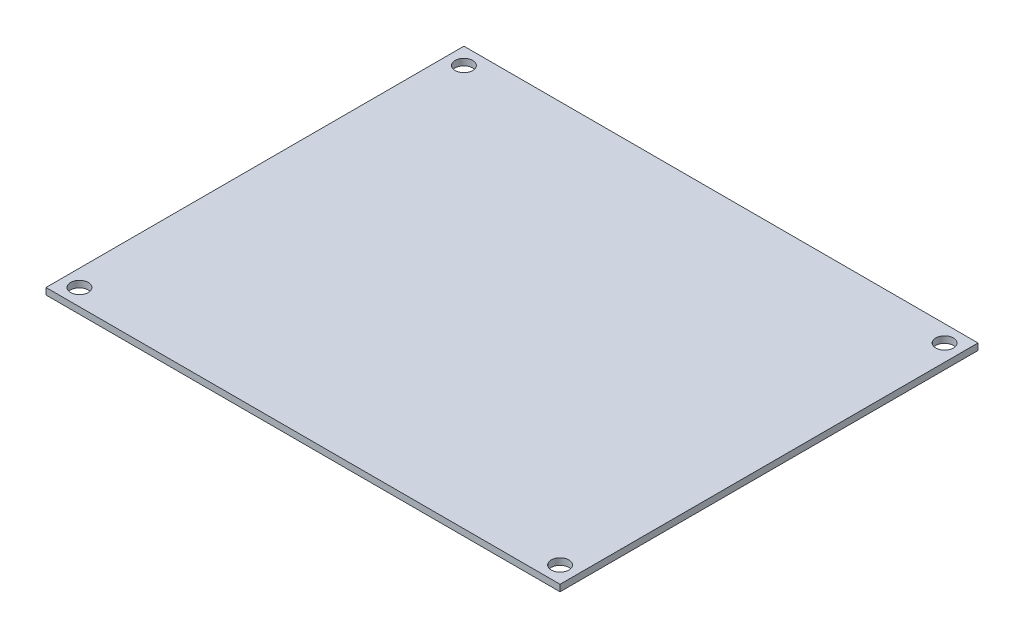
ISO-10303-21;
HEADER;
FILE_DESCRIPTION(('STEP AP214'),'2;1');
FILE_NAME('part.step','',(''),(''),'','','');
FILE_SCHEMA(('AUTOMOTIVE_DESIGN { 1 0 10303 214 1 1 1 1 }'));
ENDSEC;
DATA;
#1=APPLICATION_CONTEXT('core data for automotive mechanical design processes');
#2=APPLICATION_PROTOCOL_DEFINITION('international standard','automotive_design',2000,#1);
#3=PRODUCT_CONTEXT('',#1,'mechanical');
#4=PRODUCT('Part','Part','',(#3));
#5=PRODUCT_RELATED_PRODUCT_CATEGORY('part','',(#4));
#6=PRODUCT_DEFINITION_FORMATION('','',#4);
#7=PRODUCT_DEFINITION_CONTEXT('part definition',#1,'design');
#8=PRODUCT_DEFINITION('design','',#6,#7);
#9=PRODUCT_DEFINITION_SHAPE('','',#8);
#10=(LENGTH_UNIT() NAMED_UNIT(*) SI_UNIT(.MILLI.,.METRE.));
#11=(NAMED_UNIT(*) PLANE_ANGLE_UNIT() SI_UNIT($,.RADIAN.));
#12=(NAMED_UNIT(*) SI_UNIT($,.STERADIAN.) SOLID_ANGLE_UNIT());
#13=UNCERTAINTY_MEASURE_WITH_UNIT(LENGTH_MEASURE(1.E-05),#10,'distance_accuracy_value','');
#14=(GEOMETRIC_REPRESENTATION_CONTEXT(3) GLOBAL_UNCERTAINTY_ASSIGNED_CONTEXT((#13)) GLOBAL_UNIT_ASSIGNED_CONTEXT((#10,
#11,#12)) REPRESENTATION_CONTEXT('',''));
#15=CARTESIAN_POINT('',(0.,0.,0.));
#16=DIRECTION('',(0.,0.,1.));
#17=DIRECTION('',(1.,0.,0.));
#18=AXIS2_PLACEMENT_3D('',#15,#16,#17);
#19=CARTESIAN_POINT('',(0.,1.56999999999999,0.));
#20=DIRECTION('',(0.,-1.,0.));
#21=DIRECTION('',(0.,0.,-1.));
#22=AXIS2_PLACEMENT_3D('',#19,#20,#21);
#23=PLANE('',#22);
#24=DIRECTION('',(0.,0.,1.));
#25=VECTOR('',#24,1.);
#26=CARTESIAN_POINT('',(0.,1.56999999999999,0.));
#27=LINE('',#26,#25);
#28=CARTESIAN_POINT('',(0.,1.57000000000002,-100.));
#29=VERTEX_POINT('',#28);
#30=CARTESIAN_POINT('',(0.,1.56999999999999,0.));
#31=VERTEX_POINT('',#30);
#32=EDGE_CURVE('E84',#29,#31,#27,.T.);
#33=ORIENTED_EDGE('',*,*,#32,.T.);
#34=DIRECTION('',(1.,0.,0.));
#35=VECTOR('',#34,1.);
#36=CARTESIAN_POINT('',(0.,1.56999999999999,0.));
#37=LINE('',#36,#35);
#38=CARTESIAN_POINT('',(123.,1.56999999999999,0.));
#39=VERTEX_POINT('',#38);
#40=EDGE_CURVE('E79',#31,#39,#37,.T.);
#41=ORIENTED_EDGE('',*,*,#40,.T.);
#42=DIRECTION('',(0.,0.,-1.));
#43=VECTOR('',#42,1.);
#44=CARTESIAN_POINT('',(123.,1.56999999999999,0.));
#45=LINE('',#44,#43);
#46=CARTESIAN_POINT('',(123.,1.57000000000002,-100.));
#47=VERTEX_POINT('',#46);
#48=EDGE_CURVE('E82',#39,#47,#45,.T.);
#49=ORIENTED_EDGE('',*,*,#48,.T.);
#50=DIRECTION('',(-1.,0.,0.));
#51=VECTOR('',#50,1.);
#52=CARTESIAN_POINT('',(0.,1.57000000000002,-100.));
#53=LINE('',#52,#51);
#54=EDGE_CURVE('E49',#47,#29,#53,.T.);
#55=ORIENTED_EDGE('',*,*,#54,.T.);
#56=EDGE_LOOP('',(#33,#41,#49,#55));
#57=FACE_BOUND('',#56,.T.);
#58=CARTESIAN_POINT('',(3.99999999999995,1.57000000000002,-96.));
#59=DIRECTION('',(0.,1.,0.));
#60=DIRECTION('',(0.,0.,1.));
#61=AXIS2_PLACEMENT_3D('',#58,#59,#60);
#62=CIRCLE('',#61,2.1);
#63=CARTESIAN_POINT('',(3.99999999999995,1.57000000000002,-98.1));
#64=VERTEX_POINT('',#63);
#65=EDGE_CURVE('E99',#64,#64,#62,.T.);
#66=ORIENTED_EDGE('',*,*,#65,.F.);
#67=EDGE_LOOP('',(#66));
#68=FACE_BOUND('',#67,.T.);
#69=CARTESIAN_POINT('',(119.,1.57000000000002,-96.));
#70=DIRECTION('',(0.,1.,0.));
#71=DIRECTION('',(0.,0.,1.));
#72=AXIS2_PLACEMENT_3D('',#69,#70,#71);
#73=CIRCLE('',#72,2.1);
#74=CARTESIAN_POINT('',(119.,1.57000000000002,-98.1));
#75=VERTEX_POINT('',#74);
#76=EDGE_CURVE('E114',#75,#75,#73,.T.);
#77=ORIENTED_EDGE('',*,*,#76,.F.);
#78=EDGE_LOOP('',(#77));
#79=FACE_BOUND('',#78,.T.);
#80=CARTESIAN_POINT('',(119.,1.56999999999999,-4.));
#81=DIRECTION('',(0.,1.,0.));
#82=DIRECTION('',(0.,0.,1.));
#83=AXIS2_PLACEMENT_3D('',#80,#81,#82);
#84=CIRCLE('',#83,2.1);
#85=CARTESIAN_POINT('',(119.,1.56999999999999,-6.10000000000001));
#86=VERTEX_POINT('',#85);
#87=EDGE_CURVE('E120',#86,#86,#84,.T.);
#88=ORIENTED_EDGE('',*,*,#87,.F.);
#89=EDGE_LOOP('',(#88));
#90=FACE_BOUND('',#89,.T.);
#91=CARTESIAN_POINT('',(3.99999999999995,1.56999999999999,-4.));
#92=DIRECTION('',(0.,1.,0.));
#93=DIRECTION('',(0.,0.,1.));
#94=AXIS2_PLACEMENT_3D('',#91,#92,#93);
#95=CIRCLE('',#94,2.1);
#96=CARTESIAN_POINT('',(3.99999999999995,1.56999999999999,-6.1));
#97=VERTEX_POINT('',#96);
#98=EDGE_CURVE('E126',#97,#97,#95,.T.);
#99=ORIENTED_EDGE('',*,*,#98,.F.);
#100=EDGE_LOOP('',(#99));
#101=FACE_BOUND('',#100,.T.);
#102=ADVANCED_FACE('F32',(#57,#68,#79,#90,#101),#23,.F.);
#103=CARTESIAN_POINT('',(0.,0.,0.));
#104=DIRECTION('',(0.,-1.,0.));
#105=DIRECTION('',(0.,0.,-1.));
#106=AXIS2_PLACEMENT_3D('',#103,#104,#105);
#107=PLANE('',#106);
#108=CARTESIAN_POINT('',(119.,0.,-4.));
#109=DIRECTION('',(0.,1.,0.));
#110=DIRECTION('',(0.,0.,1.));
#111=AXIS2_PLACEMENT_3D('',#108,#109,#110);
#112=CIRCLE('',#111,2.1);
#113=CARTESIAN_POINT('',(119.,0.,-6.10000000000001));
#114=VERTEX_POINT('',#113);
#115=EDGE_CURVE('E123',#114,#114,#112,.T.);
#116=ORIENTED_EDGE('',*,*,#115,.T.);
#117=EDGE_LOOP('',(#116));
#118=FACE_BOUND('',#117,.T.);
#119=CARTESIAN_POINT('',(3.99999999999995,0.,-96.));
#120=DIRECTION('',(0.,1.,0.));
#121=DIRECTION('',(0.,0.,1.));
#122=AXIS2_PLACEMENT_3D('',#119,#120,#121);
#123=CIRCLE('',#122,2.1);
#124=CARTESIAN_POINT('',(3.99999999999995,0.,-98.1));
#125=VERTEX_POINT('',#124);
#126=EDGE_CURVE('E111',#125,#125,#123,.T.);
#127=ORIENTED_EDGE('',*,*,#126,.T.);
#128=EDGE_LOOP('',(#127));
#129=FACE_BOUND('',#128,.T.);
#130=DIRECTION('',(0.,0.,1.));
#131=VECTOR('',#130,1.);
#132=CARTESIAN_POINT('',(0.,0.,0.));
#133=LINE('',#132,#131);
#134=CARTESIAN_POINT('',(0.,0.,-100.));
#135=VERTEX_POINT('',#134);
#136=CARTESIAN_POINT('',(0.,0.,0.));
#137=VERTEX_POINT('',#136);
#138=EDGE_CURVE('E96',#135,#137,#133,.T.);
#139=ORIENTED_EDGE('',*,*,#138,.F.);
#140=DIRECTION('',(-1.,0.,0.));
#141=VECTOR('',#140,1.);
#142=CARTESIAN_POINT('',(0.,0.,-100.));
#143=LINE('',#142,#141);
#144=CARTESIAN_POINT('',(123.,0.,-100.));
#145=VERTEX_POINT('',#144);
#146=EDGE_CURVE('E72',#145,#135,#143,.T.);
#147=ORIENTED_EDGE('',*,*,#146,.F.);
#148=DIRECTION('',(0.,0.,-1.));
#149=VECTOR('',#148,1.);
#150=CARTESIAN_POINT('',(123.,0.,0.));
#151=LINE('',#150,#149);
#152=CARTESIAN_POINT('',(123.,0.,0.));
#153=VERTEX_POINT('',#152);
#154=EDGE_CURVE('E66',#153,#145,#151,.T.);
#155=ORIENTED_EDGE('',*,*,#154,.F.);
#156=DIRECTION('',(1.,0.,0.));
#157=VECTOR('',#156,1.);
#158=CARTESIAN_POINT('',(0.,0.,0.));
#159=LINE('',#158,#157);
#160=EDGE_CURVE('E88',#137,#153,#159,.T.);
#161=ORIENTED_EDGE('',*,*,#160,.F.);
#162=EDGE_LOOP('',(#139,#147,#155,#161));
#163=FACE_BOUND('',#162,.T.);
#164=CARTESIAN_POINT('',(119.,0.,-96.));
#165=DIRECTION('',(0.,1.,0.));
#166=DIRECTION('',(0.,0.,1.));
#167=AXIS2_PLACEMENT_3D('',#164,#165,#166);
#168=CIRCLE('',#167,2.1);
#169=CARTESIAN_POINT('',(119.,0.,-98.1));
#170=VERTEX_POINT('',#169);
#171=EDGE_CURVE('E117',#170,#170,#168,.T.);
#172=ORIENTED_EDGE('',*,*,#171,.T.);
#173=EDGE_LOOP('',(#172));
#174=FACE_BOUND('',#173,.T.);
#175=CARTESIAN_POINT('',(3.99999999999995,0.,-4.));
#176=DIRECTION('',(0.,1.,0.));
#177=DIRECTION('',(0.,0.,1.));
#178=AXIS2_PLACEMENT_3D('',#175,#176,#177);
#179=CIRCLE('',#178,2.1);
#180=CARTESIAN_POINT('',(3.99999999999995,0.,-6.1));
#181=VERTEX_POINT('',#180);
#182=EDGE_CURVE('E129',#181,#181,#179,.T.);
#183=ORIENTED_EDGE('',*,*,#182,.T.);
#184=EDGE_LOOP('',(#183));
#185=FACE_BOUND('',#184,.T.);
#186=ADVANCED_FACE('F107',(#118,#129,#163,#174,#185),#107,.T.);
#187=CARTESIAN_POINT('',(0.,1.56999999999999,0.));
#188=DIRECTION('',(1.,0.,0.));
#189=DIRECTION('',(0.,0.,-1.));
#190=AXIS2_PLACEMENT_3D('',#187,#188,#189);
#191=PLANE('',#190);
#192=ORIENTED_EDGE('',*,*,#138,.T.);
#193=DIRECTION('',(0.,-1.,0.));
#194=VECTOR('',#193,1.);
#195=CARTESIAN_POINT('',(0.,1.56999999999999,0.));
#196=LINE('',#195,#194);
#197=EDGE_CURVE('E11',#31,#137,#196,.T.);
#198=ORIENTED_EDGE('',*,*,#197,.F.);
#199=ORIENTED_EDGE('',*,*,#32,.F.);
#200=DIRECTION('',(0.,-1.,0.));
#201=VECTOR('',#200,1.);
#202=CARTESIAN_POINT('',(0.,1.57000000000002,-100.));
#203=LINE('',#202,#201);
#204=EDGE_CURVE('E92',#29,#135,#203,.T.);
#205=ORIENTED_EDGE('',*,*,#204,.T.);
#206=EDGE_LOOP('',(#192,#198,#199,#205));
#207=FACE_BOUND('',#206,.T.);
#208=ADVANCED_FACE('F34',(#207),#191,.F.);
#209=CARTESIAN_POINT('',(0.,1.56999999999999,0.));
#210=DIRECTION('',(0.,0.,-1.));
#211=DIRECTION('',(-1.,0.,0.));
#212=AXIS2_PLACEMENT_3D('',#209,#210,#211);
#213=PLANE('',#212);
#214=ORIENTED_EDGE('',*,*,#160,.T.);
#215=DIRECTION('',(0.,-1.,0.));
#216=VECTOR('',#215,1.);
#217=CARTESIAN_POINT('',(123.,1.56999999999999,0.));
#218=LINE('',#217,#216);
#219=EDGE_CURVE('E41',#39,#153,#218,.T.);
#220=ORIENTED_EDGE('',*,*,#219,.F.);
#221=ORIENTED_EDGE('',*,*,#40,.F.);
#222=ORIENTED_EDGE('',*,*,#197,.T.);
#223=EDGE_LOOP('',(#214,#220,#221,#222));
#224=FACE_BOUND('',#223,.T.);
#225=ADVANCED_FACE('F87',(#224),#213,.F.);
#226=CARTESIAN_POINT('',(123.,1.56999999999999,0.));
#227=DIRECTION('',(-1.,0.,0.));
#228=DIRECTION('',(0.,0.,1.));
#229=AXIS2_PLACEMENT_3D('',#226,#227,#228);
#230=PLANE('',#229);
#231=ORIENTED_EDGE('',*,*,#154,.T.);
#232=DIRECTION('',(0.,-1.,0.));
#233=VECTOR('',#232,1.);
#234=CARTESIAN_POINT('',(123.,1.57000000000002,-100.));
#235=LINE('',#234,#233);
#236=EDGE_CURVE('E89',#47,#145,#235,.T.);
#237=ORIENTED_EDGE('',*,*,#236,.F.);
#238=ORIENTED_EDGE('',*,*,#48,.F.);
#239=ORIENTED_EDGE('',*,*,#219,.T.);
#240=EDGE_LOOP('',(#231,#237,#238,#239));
#241=FACE_BOUND('',#240,.T.);
#242=ADVANCED_FACE('F90',(#241),#230,.F.);
#243=CARTESIAN_POINT('',(0.,1.57000000000002,-100.));
#244=DIRECTION('',(0.,0.,1.));
#245=DIRECTION('',(1.,0.,0.));
#246=AXIS2_PLACEMENT_3D('',#243,#244,#245);
#247=PLANE('',#246);
#248=ORIENTED_EDGE('',*,*,#146,.T.);
#249=ORIENTED_EDGE('',*,*,#204,.F.);
#250=ORIENTED_EDGE('',*,*,#54,.F.);
#251=ORIENTED_EDGE('',*,*,#236,.T.);
#252=EDGE_LOOP('',(#248,#249,#250,#251));
#253=FACE_BOUND('',#252,.T.);
#254=ADVANCED_FACE('F104',(#253),#247,.F.);
#255=CARTESIAN_POINT('',(3.99999999999995,1.57000000000002,-96.));
#256=DIRECTION('',(0.,-1.,0.));
#257=DIRECTION('',(0.,0.,-1.));
#258=AXIS2_PLACEMENT_3D('',#255,#256,#257);
#259=CYLINDRICAL_SURFACE('',#258,2.1);
#260=CARTESIAN_POINT('',(3.99999999999995,1.57000000000002,-98.1));
#261=CARTESIAN_POINT('',(3.99999999999995,1.55364583333335,-98.1));
#262=CARTESIAN_POINT('',(3.99999999999995,1.53729166666668,-98.1));
#263=CARTESIAN_POINT('',(3.99999999999995,1.50458333333335,-98.1));
#264=CARTESIAN_POINT('',(3.99999999999995,1.48822916666668,-98.1));
#265=CARTESIAN_POINT('',(3.99999999999995,1.45552083333335,-98.1));
#266=CARTESIAN_POINT('',(3.99999999999995,1.43916666666668,-98.1));
#267=CARTESIAN_POINT('',(3.99999999999995,1.40645833333335,-98.1));
#268=CARTESIAN_POINT('',(3.99999999999995,1.39010416666668,-98.1));
#269=CARTESIAN_POINT('',(3.99999999999995,1.35739583333335,-98.1));
#270=CARTESIAN_POINT('',(3.99999999999995,1.34104166666668,-98.1));
#271=CARTESIAN_POINT('',(3.99999999999995,1.30833333333335,-98.1));
#272=CARTESIAN_POINT('',(3.99999999999995,1.29197916666668,-98.1));
#273=CARTESIAN_POINT('',(3.99999999999995,1.25927083333335,-98.1));
#274=CARTESIAN_POINT('',(3.99999999999995,1.24291666666668,-98.1));
#275=CARTESIAN_POINT('',(3.99999999999995,1.21020833333335,-98.1));
#276=CARTESIAN_POINT('',(3.99999999999995,1.19385416666668,-98.1));
#277=CARTESIAN_POINT('',(3.99999999999995,1.16114583333334,-98.1));
#278=CARTESIAN_POINT('',(3.99999999999995,1.14479166666668,-98.1));
#279=CARTESIAN_POINT('',(3.99999999999995,1.11208333333334,-98.1));
#280=CARTESIAN_POINT('',(3.99999999999995,1.09572916666668,-98.1));
#281=CARTESIAN_POINT('',(3.99999999999995,1.06302083333334,-98.1));
#282=CARTESIAN_POINT('',(3.99999999999995,1.04666666666668,-98.1));
#283=CARTESIAN_POINT('',(3.99999999999995,1.01395833333334,-98.1));
#284=CARTESIAN_POINT('',(3.99999999999995,0.997604166666677,-98.1));
#285=CARTESIAN_POINT('',(3.99999999999995,0.964895833333343,-98.1));
#286=CARTESIAN_POINT('',(3.99999999999995,0.948541666666676,-98.1));
#287=CARTESIAN_POINT('',(3.99999999999995,0.915833333333342,-98.1));
#288=CARTESIAN_POINT('',(3.99999999999995,0.899479166666676,-98.1));
#289=CARTESIAN_POINT('',(3.99999999999995,0.866770833333342,-98.1));
#290=CARTESIAN_POINT('',(3.99999999999995,0.850416666666675,-98.1));
#291=CARTESIAN_POINT('',(3.99999999999995,0.817708333333342,-98.1));
#292=CARTESIAN_POINT('',(3.99999999999995,0.801354166666675,-98.1));
#293=CARTESIAN_POINT('',(3.99999999999995,0.768645833333341,-98.1));
#294=CARTESIAN_POINT('',(3.99999999999995,0.752291666666674,-98.1));
#295=CARTESIAN_POINT('',(3.99999999999995,0.719583333333341,-98.1));
#296=CARTESIAN_POINT('',(3.99999999999995,0.703229166666674,-98.1));
#297=CARTESIAN_POINT('',(3.99999999999995,0.67052083333334,-98.1));
#298=CARTESIAN_POINT('',(3.99999999999995,0.654166666666673,-98.1));
#299=CARTESIAN_POINT('',(3.99999999999995,0.62145833333334,-98.1));
#300=CARTESIAN_POINT('',(3.99999999999995,0.605104166666673,-98.1));
#301=CARTESIAN_POINT('',(3.99999999999995,0.572395833333339,-98.1));
#302=CARTESIAN_POINT('',(3.99999999999995,0.556041666666672,-98.1));
#303=CARTESIAN_POINT('',(3.99999999999995,0.523333333333338,-98.1));
#304=CARTESIAN_POINT('',(3.99999999999995,0.506979166666672,-98.1));
#305=CARTESIAN_POINT('',(3.99999999999995,0.474270833333338,-98.1));
#306=CARTESIAN_POINT('',(3.99999999999995,0.457916666666671,-98.1));
#307=CARTESIAN_POINT('',(3.99999999999995,0.425208333333337,-98.1));
#308=CARTESIAN_POINT('',(3.99999999999995,0.408854166666671,-98.1));
#309=CARTESIAN_POINT('',(3.99999999999995,0.376145833333337,-98.1));
#310=CARTESIAN_POINT('',(3.99999999999995,0.35979166666667,-98.1));
#311=CARTESIAN_POINT('',(3.99999999999995,0.327083333333336,-98.1));
#312=CARTESIAN_POINT('',(3.99999999999995,0.31072916666667,-98.1));
#313=CARTESIAN_POINT('',(3.99999999999995,0.278020833333336,-98.1));
#314=CARTESIAN_POINT('',(3.99999999999995,0.261666666666669,-98.1));
#315=CARTESIAN_POINT('',(3.99999999999995,0.228958333333335,-98.1));
#316=CARTESIAN_POINT('',(3.99999999999995,0.212604166666669,-98.1));
#317=CARTESIAN_POINT('',(3.99999999999995,0.179895833333335,-98.1));
#318=CARTESIAN_POINT('',(3.99999999999995,0.163541666666668,-98.1));
#319=CARTESIAN_POINT('',(3.99999999999995,0.130833333333334,-98.1));
#320=CARTESIAN_POINT('',(3.99999999999995,0.114479166666668,-98.1));
#321=CARTESIAN_POINT('',(3.99999999999995,0.0817708333333342,-98.1));
#322=CARTESIAN_POINT('',(3.99999999999995,0.0654166666666673,-98.1));
#323=CARTESIAN_POINT('',(3.99999999999995,0.0327083333333337,-98.1));
#324=CARTESIAN_POINT('',(3.99999999999995,0.0163541666666668,-98.1));
#325=CARTESIAN_POINT('',(3.99999999999995,0.,-98.1));
#326=B_SPLINE_CURVE_WITH_KNOTS('',3,(#260,#261,#262,#263,#264,#265,#266,#267,#268,#269,#270,
#271,#272,#273,#274,#275,#276,#277,#278,#279,#280,#281,#282,#283,#284,#285,#286,#287,#288,#289,
#290,#291,#292,#293,#294,#295,#296,#297,#298,#299,#300,#301,#302,#303,#304,#305,#306,#307,#308,
#309,#310,#311,#312,#313,#314,#315,#316,#317,#318,#319,#320,#321,#322,#323,#324,#325),
.UNSPECIFIED.,.F.,.F.,(4,2,2,2,2,2,2,2,2,2,2,2,2,2,2,2,2,2,2,2,2,2,2,2,2,2,2,2,2,2,2,2,4),(0.,
0.0490625000000003,0.0981250000000008,0.147187500000001,0.196250000000002,0.245312500000002,
0.294375000000003,0.343437500000003,0.392500000000004,0.441562500000004,0.490625000000005,
0.539687500000005,0.588750000000006,0.637812500000006,0.686875000000007,0.735937500000007,
0.785000000000008,0.834062500000008,0.883125000000009,0.932187500000009,0.98125000000001,
1.03031250000001,1.07937500000001,1.12843750000001,1.17750000000001,1.22656250000001,
1.27562500000001,1.32468750000001,1.37375000000001,1.42281250000001,1.47187500000001,
1.52093750000002,1.57000000000002),.UNSPECIFIED.);
#327=EDGE_CURVE('BSEAM146',#64,#125,#326,.T.);
#328=ORIENTED_EDGE('',*,*,#65,.T.);
#329=ORIENTED_EDGE('',*,*,#126,.F.);
#330=ORIENTED_EDGE('',*,*,#327,.T.);
#331=ORIENTED_EDGE('',*,*,#327,.F.);
#332=EDGE_LOOP('',(#328,#330,#329,#331));
#333=FACE_BOUND('',#332,.T.);
#334=ADVANCED_FACE('F146',(#333),#259,.F.);
#335=CARTESIAN_POINT('',(119.,1.57000000000002,-96.));
#336=DIRECTION('',(0.,-1.,0.));
#337=DIRECTION('',(0.,0.,-1.));
#338=AXIS2_PLACEMENT_3D('',#335,#336,#337);
#339=CYLINDRICAL_SURFACE('',#338,2.1);
#340=CARTESIAN_POINT('',(119.,1.57000000000002,-98.1));
#341=CARTESIAN_POINT('',(119.,1.55364583333335,-98.1));
#342=CARTESIAN_POINT('',(119.,1.53729166666668,-98.1));
#343=CARTESIAN_POINT('',(119.,1.50458333333335,-98.1));
#344=CARTESIAN_POINT('',(119.,1.48822916666668,-98.1));
#345=CARTESIAN_POINT('',(119.,1.45552083333335,-98.1));
#346=CARTESIAN_POINT('',(119.,1.43916666666668,-98.1));
#347=CARTESIAN_POINT('',(119.,1.40645833333335,-98.1));
#348=CARTESIAN_POINT('',(119.,1.39010416666668,-98.1));
#349=CARTESIAN_POINT('',(119.,1.35739583333335,-98.1));
#350=CARTESIAN_POINT('',(119.,1.34104166666668,-98.1));
#351=CARTESIAN_POINT('',(119.,1.30833333333335,-98.1));
#352=CARTESIAN_POINT('',(119.,1.29197916666668,-98.1));
#353=CARTESIAN_POINT('',(119.,1.25927083333335,-98.1));
#354=CARTESIAN_POINT('',(119.,1.24291666666668,-98.1));
#355=CARTESIAN_POINT('',(119.,1.21020833333335,-98.1));
#356=CARTESIAN_POINT('',(119.,1.19385416666668,-98.1));
#357=CARTESIAN_POINT('',(119.,1.16114583333334,-98.1));
#358=CARTESIAN_POINT('',(119.,1.14479166666668,-98.1));
#359=CARTESIAN_POINT('',(119.,1.11208333333334,-98.1));
#360=CARTESIAN_POINT('',(119.,1.09572916666668,-98.1));
#361=CARTESIAN_POINT('',(119.,1.06302083333334,-98.1));
#362=CARTESIAN_POINT('',(119.,1.04666666666668,-98.1));
#363=CARTESIAN_POINT('',(119.,1.01395833333334,-98.1));
#364=CARTESIAN_POINT('',(119.,0.997604166666677,-98.1));
#365=CARTESIAN_POINT('',(119.,0.964895833333343,-98.1));
#366=CARTESIAN_POINT('',(119.,0.948541666666676,-98.1));
#367=CARTESIAN_POINT('',(119.,0.915833333333342,-98.1));
#368=CARTESIAN_POINT('',(119.,0.899479166666676,-98.1));
#369=CARTESIAN_POINT('',(119.,0.866770833333342,-98.1));
#370=CARTESIAN_POINT('',(119.,0.850416666666675,-98.1));
#371=CARTESIAN_POINT('',(119.,0.817708333333342,-98.1));
#372=CARTESIAN_POINT('',(119.,0.801354166666675,-98.1));
#373=CARTESIAN_POINT('',(119.,0.768645833333341,-98.1));
#374=CARTESIAN_POINT('',(119.,0.752291666666674,-98.1));
#375=CARTESIAN_POINT('',(119.,0.719583333333341,-98.1));
#376=CARTESIAN_POINT('',(119.,0.703229166666674,-98.1));
#377=CARTESIAN_POINT('',(119.,0.67052083333334,-98.1));
#378=CARTESIAN_POINT('',(119.,0.654166666666673,-98.1));
#379=CARTESIAN_POINT('',(119.,0.62145833333334,-98.1));
#380=CARTESIAN_POINT('',(119.,0.605104166666673,-98.1));
#381=CARTESIAN_POINT('',(119.,0.572395833333339,-98.1));
#382=CARTESIAN_POINT('',(119.,0.556041666666672,-98.1));
#383=CARTESIAN_POINT('',(119.,0.523333333333338,-98.1));
#384=CARTESIAN_POINT('',(119.,0.506979166666672,-98.1));
#385=CARTESIAN_POINT('',(119.,0.474270833333338,-98.1));
#386=CARTESIAN_POINT('',(119.,0.457916666666671,-98.1));
#387=CARTESIAN_POINT('',(119.,0.425208333333337,-98.1));
#388=CARTESIAN_POINT('',(119.,0.408854166666671,-98.1));
#389=CARTESIAN_POINT('',(119.,0.376145833333337,-98.1));
#390=CARTESIAN_POINT('',(119.,0.35979166666667,-98.1));
#391=CARTESIAN_POINT('',(119.,0.327083333333336,-98.1));
#392=CARTESIAN_POINT('',(119.,0.31072916666667,-98.1));
#393=CARTESIAN_POINT('',(119.,0.278020833333336,-98.1));
#394=CARTESIAN_POINT('',(119.,0.261666666666669,-98.1));
#395=CARTESIAN_POINT('',(119.,0.228958333333335,-98.1));
#396=CARTESIAN_POINT('',(119.,0.212604166666669,-98.1));
#397=CARTESIAN_POINT('',(119.,0.179895833333335,-98.1));
#398=CARTESIAN_POINT('',(119.,0.163541666666668,-98.1));
#399=CARTESIAN_POINT('',(119.,0.130833333333334,-98.1));
#400=CARTESIAN_POINT('',(119.,0.114479166666668,-98.1));
#401=CARTESIAN_POINT('',(119.,0.0817708333333342,-98.1));
#402=CARTESIAN_POINT('',(119.,0.0654166666666673,-98.1));
#403=CARTESIAN_POINT('',(119.,0.0327083333333337,-98.1));
#404=CARTESIAN_POINT('',(119.,0.0163541666666668,-98.1));
#405=CARTESIAN_POINT('',(119.,0.,-98.1));
#406=B_SPLINE_CURVE_WITH_KNOTS('',3,(#340,#341,#342,#343,#344,#345,#346,#347,#348,#349,#350,
#351,#352,#353,#354,#355,#356,#357,#358,#359,#360,#361,#362,#363,#364,#365,#366,#367,#368,#369,
#370,#371,#372,#373,#374,#375,#376,#377,#378,#379,#380,#381,#382,#383,#384,#385,#386,#387,#388,
#389,#390,#391,#392,#393,#394,#395,#396,#397,#398,#399,#400,#401,#402,#403,#404,#405),
.UNSPECIFIED.,.F.,.F.,(4,2,2,2,2,2,2,2,2,2,2,2,2,2,2,2,2,2,2,2,2,2,2,2,2,2,2,2,2,2,2,2,4),(0.,
0.0490625000000003,0.0981250000000008,0.147187500000001,0.196250000000002,0.245312500000002,
0.294375000000003,0.343437500000003,0.392500000000004,0.441562500000004,0.490625000000005,
0.539687500000005,0.588750000000006,0.637812500000006,0.686875000000007,0.735937500000007,
0.785000000000008,0.834062500000008,0.883125000000009,0.932187500000009,0.98125000000001,
1.03031250000001,1.07937500000001,1.12843750000001,1.17750000000001,1.22656250000001,
1.27562500000001,1.32468750000001,1.37375000000001,1.42281250000001,1.47187500000001,
1.52093750000002,1.57000000000002),.UNSPECIFIED.);
#407=EDGE_CURVE('BSEAM192',#75,#170,#406,.T.);
#408=ORIENTED_EDGE('',*,*,#76,.T.);
#409=ORIENTED_EDGE('',*,*,#171,.F.);
#410=ORIENTED_EDGE('',*,*,#407,.T.);
#411=ORIENTED_EDGE('',*,*,#407,.F.);
#412=EDGE_LOOP('',(#408,#410,#409,#411));
#413=FACE_BOUND('',#412,.T.);
#414=ADVANCED_FACE('F192',(#413),#339,.F.);
#415=CARTESIAN_POINT('',(119.,1.56999999999999,-4.));
#416=DIRECTION('',(0.,-1.,0.));
#417=DIRECTION('',(0.,0.,-1.));
#418=AXIS2_PLACEMENT_3D('',#415,#416,#417);
#419=CYLINDRICAL_SURFACE('',#418,2.1);
#420=CARTESIAN_POINT('',(119.,1.56999999999999,-6.10000000000001));
#421=CARTESIAN_POINT('',(119.,1.55364583333332,-6.10000000000001));
#422=CARTESIAN_POINT('',(119.,1.53729166666665,-6.10000000000001));
#423=CARTESIAN_POINT('',(119.,1.50458333333332,-6.10000000000001));
#424=CARTESIAN_POINT('',(119.,1.48822916666666,-6.10000000000001));
#425=CARTESIAN_POINT('',(119.,1.45552083333332,-6.10000000000001));
#426=CARTESIAN_POINT('',(119.,1.43916666666666,-6.10000000000001));
#427=CARTESIAN_POINT('',(119.,1.40645833333332,-6.10000000000001));
#428=CARTESIAN_POINT('',(119.,1.39010416666666,-6.10000000000001));
#429=CARTESIAN_POINT('',(119.,1.35739583333332,-6.10000000000001));
#430=CARTESIAN_POINT('',(119.,1.34104166666666,-6.10000000000001));
#431=CARTESIAN_POINT('',(119.,1.30833333333332,-6.10000000000001));
#432=CARTESIAN_POINT('',(119.,1.29197916666666,-6.10000000000001));
#433=CARTESIAN_POINT('',(119.,1.25927083333332,-6.10000000000001));
#434=CARTESIAN_POINT('',(119.,1.24291666666666,-6.10000000000001));
#435=CARTESIAN_POINT('',(119.,1.21020833333332,-6.10000000000001));
#436=CARTESIAN_POINT('',(119.,1.19385416666666,-6.10000000000001));
#437=CARTESIAN_POINT('',(119.,1.16114583333332,-6.10000000000001));
#438=CARTESIAN_POINT('',(119.,1.14479166666666,-6.10000000000001));
#439=CARTESIAN_POINT('',(119.,1.11208333333332,-6.10000000000001));
#440=CARTESIAN_POINT('',(119.,1.09572916666666,-6.10000000000001));
#441=CARTESIAN_POINT('',(119.,1.06302083333333,-6.10000000000001));
#442=CARTESIAN_POINT('',(119.,1.04666666666666,-6.10000000000001));
#443=CARTESIAN_POINT('',(119.,1.01395833333333,-6.10000000000001));
#444=CARTESIAN_POINT('',(119.,0.997604166666659,-6.10000000000001));
#445=CARTESIAN_POINT('',(119.,0.964895833333326,-6.10000000000001));
#446=CARTESIAN_POINT('',(119.,0.948541666666659,-6.10000000000001));
#447=CARTESIAN_POINT('',(119.,0.915833333333326,-6.10000000000001));
#448=CARTESIAN_POINT('',(119.,0.89947916666666,-6.10000000000001));
#449=CARTESIAN_POINT('',(119.,0.866770833333327,-6.10000000000001));
#450=CARTESIAN_POINT('',(119.,0.85041666666666,-6.10000000000001));
#451=CARTESIAN_POINT('',(119.,0.817708333333327,-6.10000000000001));
#452=CARTESIAN_POINT('',(119.,0.80135416666666,-6.10000000000001));
#453=CARTESIAN_POINT('',(119.,0.768645833333327,-6.10000000000001));
#454=CARTESIAN_POINT('',(119.,0.752291666666661,-6.10000000000001));
#455=CARTESIAN_POINT('',(119.,0.719583333333328,-6.10000000000001));
#456=CARTESIAN_POINT('',(119.,0.703229166666661,-6.10000000000001));
#457=CARTESIAN_POINT('',(119.,0.670520833333328,-6.10000000000001));
#458=CARTESIAN_POINT('',(119.,0.654166666666662,-6.10000000000001));
#459=CARTESIAN_POINT('',(119.,0.621458333333329,-6.10000000000001));
#460=CARTESIAN_POINT('',(119.,0.605104166666662,-6.10000000000001));
#461=CARTESIAN_POINT('',(119.,0.572395833333329,-6.10000000000001));
#462=CARTESIAN_POINT('',(119.,0.556041666666662,-6.10000000000001));
#463=CARTESIAN_POINT('',(119.,0.523333333333329,-6.10000000000001));
#464=CARTESIAN_POINT('',(119.,0.506979166666663,-6.10000000000001));
#465=CARTESIAN_POINT('',(119.,0.47427083333333,-6.10000000000001));
#466=CARTESIAN_POINT('',(119.,0.457916666666663,-6.10000000000001));
#467=CARTESIAN_POINT('',(119.,0.42520833333333,-6.10000000000001));
#468=CARTESIAN_POINT('',(119.,0.408854166666663,-6.10000000000001));
#469=CARTESIAN_POINT('',(119.,0.37614583333333,-6.10000000000001));
#470=CARTESIAN_POINT('',(119.,0.359791666666664,-6.10000000000001));
#471=CARTESIAN_POINT('',(119.,0.327083333333331,-6.10000000000001));
#472=CARTESIAN_POINT('',(119.,0.310729166666664,-6.10000000000001));
#473=CARTESIAN_POINT('',(119.,0.278020833333331,-6.10000000000001));
#474=CARTESIAN_POINT('',(119.,0.261666666666664,-6.10000000000001));
#475=CARTESIAN_POINT('',(119.,0.228958333333331,-6.10000000000001));
#476=CARTESIAN_POINT('',(119.,0.212604166666665,-6.10000000000001));
#477=CARTESIAN_POINT('',(119.,0.179895833333332,-6.10000000000001));
#478=CARTESIAN_POINT('',(119.,0.163541666666665,-6.10000000000001));
#479=CARTESIAN_POINT('',(119.,0.130833333333332,-6.10000000000001));
#480=CARTESIAN_POINT('',(119.,0.114479166666666,-6.10000000000001));
#481=CARTESIAN_POINT('',(119.,0.0817708333333327,-6.10000000000001));
#482=CARTESIAN_POINT('',(119.,0.0654166666666662,-6.10000000000001));
#483=CARTESIAN_POINT('',(119.,0.0327083333333331,-6.10000000000001));
#484=CARTESIAN_POINT('',(119.,0.0163541666666665,-6.10000000000001));
#485=CARTESIAN_POINT('',(119.,0.,-6.10000000000001));
#486=B_SPLINE_CURVE_WITH_KNOTS('',3,(#420,#421,#422,#423,#424,#425,#426,#427,#428,#429,#430,
#431,#432,#433,#434,#435,#436,#437,#438,#439,#440,#441,#442,#443,#444,#445,#446,#447,#448,#449,
#450,#451,#452,#453,#454,#455,#456,#457,#458,#459,#460,#461,#462,#463,#464,#465,#466,#467,#468,
#469,#470,#471,#472,#473,#474,#475,#476,#477,#478,#479,#480,#481,#482,#483,#484,#485),
.UNSPECIFIED.,.F.,.F.,(4,2,2,2,2,2,2,2,2,2,2,2,2,2,2,2,2,2,2,2,2,2,2,2,2,2,2,2,2,2,2,2,4),(0.,
0.0490624999999996,0.0981249999999993,0.147187499999999,0.196249999999999,0.245312499999998,
0.294374999999998,0.343437499999998,0.392499999999997,0.441562499999997,0.490624999999996,
0.539687499999996,0.588749999999996,0.637812499999995,0.686874999999995,0.735937499999994,
0.784999999999994,0.834062499999994,0.883124999999993,0.932187499999993,0.981249999999993,
1.03031249999999,1.07937499999999,1.12843749999999,1.17749999999999,1.22656249999999,
1.27562499999999,1.32468749999999,1.37374999999999,1.42281249999999,1.47187499999999,
1.52093749999999,1.56999999999999),.UNSPECIFIED.);
#487=EDGE_CURVE('BSEAM200',#86,#114,#486,.T.);
#488=ORIENTED_EDGE('',*,*,#87,.T.);
#489=ORIENTED_EDGE('',*,*,#115,.F.);
#490=ORIENTED_EDGE('',*,*,#487,.T.);
#491=ORIENTED_EDGE('',*,*,#487,.F.);
#492=EDGE_LOOP('',(#488,#490,#489,#491));
#493=FACE_BOUND('',#492,.T.);
#494=ADVANCED_FACE('F200',(#493),#419,.F.);
#495=CARTESIAN_POINT('',(3.99999999999995,1.56999999999999,-4.));
#496=DIRECTION('',(0.,-1.,0.));
#497=DIRECTION('',(0.,0.,-1.));
#498=AXIS2_PLACEMENT_3D('',#495,#496,#497);
#499=CYLINDRICAL_SURFACE('',#498,2.1);
#500=CARTESIAN_POINT('',(3.99999999999995,1.56999999999999,-6.1));
#501=CARTESIAN_POINT('',(3.99999999999995,1.55364583333332,-6.1));
#502=CARTESIAN_POINT('',(3.99999999999995,1.53729166666665,-6.1));
#503=CARTESIAN_POINT('',(3.99999999999995,1.50458333333332,-6.1));
#504=CARTESIAN_POINT('',(3.99999999999995,1.48822916666666,-6.1));
#505=CARTESIAN_POINT('',(3.99999999999995,1.45552083333332,-6.1));
#506=CARTESIAN_POINT('',(3.99999999999995,1.43916666666666,-6.1));
#507=CARTESIAN_POINT('',(3.99999999999995,1.40645833333332,-6.1));
#508=CARTESIAN_POINT('',(3.99999999999995,1.39010416666666,-6.1));
#509=CARTESIAN_POINT('',(3.99999999999995,1.35739583333332,-6.1));
#510=CARTESIAN_POINT('',(3.99999999999995,1.34104166666666,-6.1));
#511=CARTESIAN_POINT('',(3.99999999999995,1.30833333333332,-6.1));
#512=CARTESIAN_POINT('',(3.99999999999995,1.29197916666666,-6.1));
#513=CARTESIAN_POINT('',(3.99999999999995,1.25927083333332,-6.1));
#514=CARTESIAN_POINT('',(3.99999999999995,1.24291666666666,-6.1));
#515=CARTESIAN_POINT('',(3.99999999999995,1.21020833333332,-6.1));
#516=CARTESIAN_POINT('',(3.99999999999995,1.19385416666666,-6.1));
#517=CARTESIAN_POINT('',(3.99999999999995,1.16114583333332,-6.1));
#518=CARTESIAN_POINT('',(3.99999999999995,1.14479166666666,-6.1));
#519=CARTESIAN_POINT('',(3.99999999999995,1.11208333333332,-6.1));
#520=CARTESIAN_POINT('',(3.99999999999995,1.09572916666666,-6.1));
#521=CARTESIAN_POINT('',(3.99999999999995,1.06302083333333,-6.1));
#522=CARTESIAN_POINT('',(3.99999999999995,1.04666666666666,-6.1));
#523=CARTESIAN_POINT('',(3.99999999999995,1.01395833333333,-6.1));
#524=CARTESIAN_POINT('',(3.99999999999995,0.997604166666659,-6.1));
#525=CARTESIAN_POINT('',(3.99999999999995,0.964895833333326,-6.1));
#526=CARTESIAN_POINT('',(3.99999999999995,0.948541666666659,-6.1));
#527=CARTESIAN_POINT('',(3.99999999999995,0.915833333333326,-6.1));
#528=CARTESIAN_POINT('',(3.99999999999995,0.89947916666666,-6.1));
#529=CARTESIAN_POINT('',(3.99999999999995,0.866770833333327,-6.1));
#530=CARTESIAN_POINT('',(3.99999999999995,0.85041666666666,-6.1));
#531=CARTESIAN_POINT('',(3.99999999999995,0.817708333333327,-6.1));
#532=CARTESIAN_POINT('',(3.99999999999995,0.80135416666666,-6.1));
#533=CARTESIAN_POINT('',(3.99999999999995,0.768645833333327,-6.1));
#534=CARTESIAN_POINT('',(3.99999999999995,0.752291666666661,-6.1));
#535=CARTESIAN_POINT('',(3.99999999999995,0.719583333333328,-6.1));
#536=CARTESIAN_POINT('',(3.99999999999995,0.703229166666661,-6.1));
#537=CARTESIAN_POINT('',(3.99999999999995,0.670520833333328,-6.1));
#538=CARTESIAN_POINT('',(3.99999999999995,0.654166666666662,-6.1));
#539=CARTESIAN_POINT('',(3.99999999999995,0.621458333333329,-6.1));
#540=CARTESIAN_POINT('',(3.99999999999995,0.605104166666662,-6.1));
#541=CARTESIAN_POINT('',(3.99999999999995,0.572395833333329,-6.1));
#542=CARTESIAN_POINT('',(3.99999999999995,0.556041666666662,-6.1));
#543=CARTESIAN_POINT('',(3.99999999999995,0.523333333333329,-6.1));
#544=CARTESIAN_POINT('',(3.99999999999995,0.506979166666663,-6.1));
#545=CARTESIAN_POINT('',(3.99999999999995,0.47427083333333,-6.1));
#546=CARTESIAN_POINT('',(3.99999999999995,0.457916666666663,-6.1));
#547=CARTESIAN_POINT('',(3.99999999999995,0.42520833333333,-6.1));
#548=CARTESIAN_POINT('',(3.99999999999995,0.408854166666663,-6.1));
#549=CARTESIAN_POINT('',(3.99999999999995,0.37614583333333,-6.1));
#550=CARTESIAN_POINT('',(3.99999999999995,0.359791666666664,-6.1));
#551=CARTESIAN_POINT('',(3.99999999999995,0.327083333333331,-6.1));
#552=CARTESIAN_POINT('',(3.99999999999995,0.310729166666664,-6.1));
#553=CARTESIAN_POINT('',(3.99999999999995,0.278020833333331,-6.1));
#554=CARTESIAN_POINT('',(3.99999999999995,0.261666666666664,-6.1));
#555=CARTESIAN_POINT('',(3.99999999999995,0.228958333333331,-6.1));
#556=CARTESIAN_POINT('',(3.99999999999995,0.212604166666665,-6.1));
#557=CARTESIAN_POINT('',(3.99999999999995,0.179895833333332,-6.1));
#558=CARTESIAN_POINT('',(3.99999999999995,0.163541666666665,-6.1));
#559=CARTESIAN_POINT('',(3.99999999999995,0.130833333333332,-6.1));
#560=CARTESIAN_POINT('',(3.99999999999995,0.114479166666666,-6.1));
#561=CARTESIAN_POINT('',(3.99999999999995,0.0817708333333327,-6.1));
#562=CARTESIAN_POINT('',(3.99999999999995,0.0654166666666662,-6.1));
#563=CARTESIAN_POINT('',(3.99999999999995,0.0327083333333331,-6.1));
#564=CARTESIAN_POINT('',(3.99999999999995,0.0163541666666665,-6.1));
#565=CARTESIAN_POINT('',(3.99999999999995,0.,-6.1));
#566=B_SPLINE_CURVE_WITH_KNOTS('',3,(#500,#501,#502,#503,#504,#505,#506,#507,#508,#509,#510,
#511,#512,#513,#514,#515,#516,#517,#518,#519,#520,#521,#522,#523,#524,#525,#526,#527,#528,#529,
#530,#531,#532,#533,#534,#535,#536,#537,#538,#539,#540,#541,#542,#543,#544,#545,#546,#547,#548,
#549,#550,#551,#552,#553,#554,#555,#556,#557,#558,#559,#560,#561,#562,#563,#564,#565),
.UNSPECIFIED.,.F.,.F.,(4,2,2,2,2,2,2,2,2,2,2,2,2,2,2,2,2,2,2,2,2,2,2,2,2,2,2,2,2,2,2,2,4),(0.,
0.0490624999999996,0.0981249999999993,0.147187499999999,0.196249999999999,0.245312499999998,
0.294374999999998,0.343437499999998,0.392499999999997,0.441562499999997,0.490624999999996,
0.539687499999996,0.588749999999996,0.637812499999995,0.686874999999995,0.735937499999994,
0.784999999999994,0.834062499999994,0.883124999999993,0.932187499999993,0.981249999999993,
1.03031249999999,1.07937499999999,1.12843749999999,1.17749999999999,1.22656249999999,
1.27562499999999,1.32468749999999,1.37374999999999,1.42281249999999,1.47187499999999,
1.52093749999999,1.56999999999999),.UNSPECIFIED.);
#567=EDGE_CURVE('BSEAM135',#97,#181,#566,.T.);
#568=ORIENTED_EDGE('',*,*,#98,.T.);
#569=ORIENTED_EDGE('',*,*,#182,.F.);
#570=ORIENTED_EDGE('',*,*,#567,.T.);
#571=ORIENTED_EDGE('',*,*,#567,.F.);
#572=EDGE_LOOP('',(#568,#570,#569,#571));
#573=FACE_BOUND('',#572,.T.);
#574=ADVANCED_FACE('F135',(#573),#499,.F.);
#575=CLOSED_SHELL('',(#102,#186,#208,#225,#242,#254,#334,#414,#494,#574));
#576=MANIFOLD_SOLID_BREP('B2',#575);
#577=ADVANCED_BREP_SHAPE_REPRESENTATION('',(#18,#576),#14);
#578=SHAPE_DEFINITION_REPRESENTATION(#9,#577);
ENDSEC;
END-ISO-10303-21;
